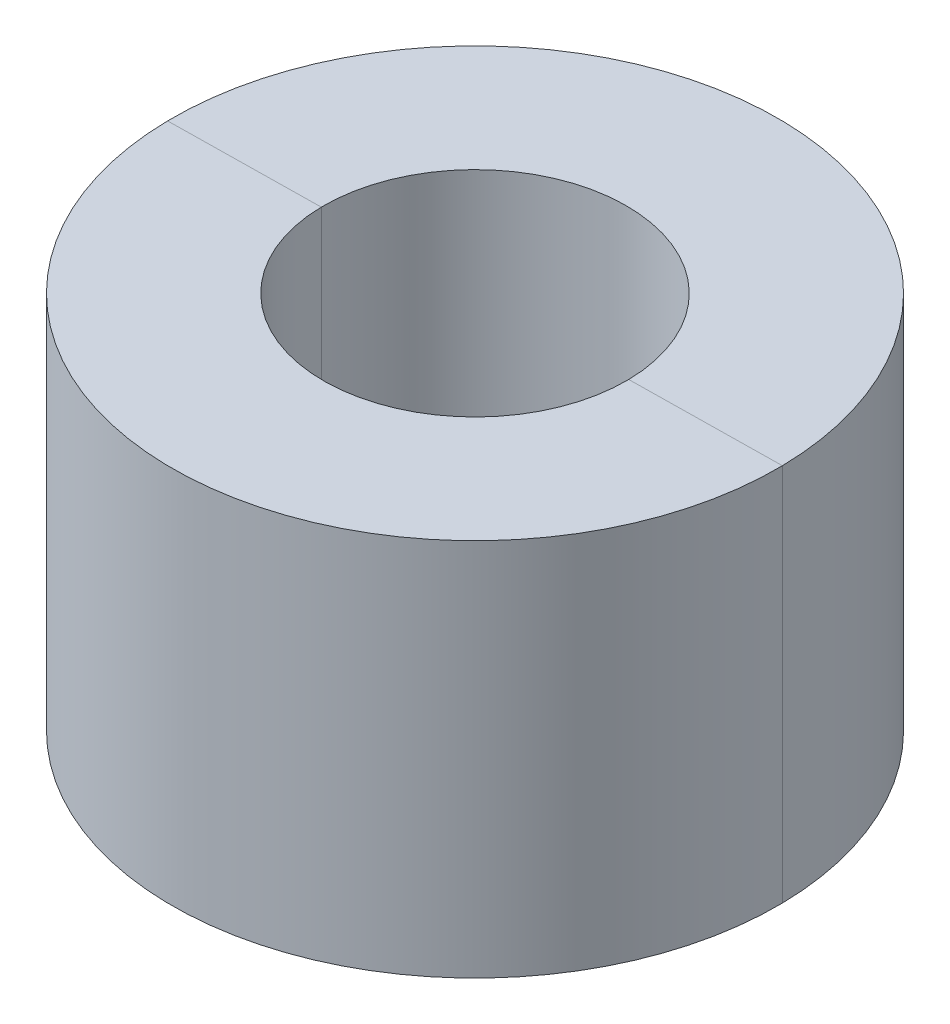
ISO-10303-21;
HEADER;
FILE_DESCRIPTION(('STEP AP214'),'2;1');
FILE_NAME('part.step','',(''),(''),'','','');
FILE_SCHEMA(('AUTOMOTIVE_DESIGN { 1 0 10303 214 1 1 1 1 }'));
ENDSEC;
DATA;
#1=APPLICATION_CONTEXT('core data for automotive mechanical design processes');
#2=APPLICATION_PROTOCOL_DEFINITION('international standard','automotive_design',2000,#1);
#3=PRODUCT_CONTEXT('',#1,'mechanical');
#4=PRODUCT('Part','Part','',(#3));
#5=PRODUCT_RELATED_PRODUCT_CATEGORY('part','',(#4));
#6=PRODUCT_DEFINITION_FORMATION('','',#4);
#7=PRODUCT_DEFINITION_CONTEXT('part definition',#1,'design');
#8=PRODUCT_DEFINITION('design','',#6,#7);
#9=PRODUCT_DEFINITION_SHAPE('','',#8);
#10=(LENGTH_UNIT() NAMED_UNIT(*) SI_UNIT(.MILLI.,.METRE.));
#11=(NAMED_UNIT(*) PLANE_ANGLE_UNIT() SI_UNIT($,.RADIAN.));
#12=(NAMED_UNIT(*) SI_UNIT($,.STERADIAN.) SOLID_ANGLE_UNIT());
#13=UNCERTAINTY_MEASURE_WITH_UNIT(LENGTH_MEASURE(1.E-05),#10,'distance_accuracy_value','');
#14=(GEOMETRIC_REPRESENTATION_CONTEXT(3) GLOBAL_UNCERTAINTY_ASSIGNED_CONTEXT((#13)) GLOBAL_UNIT_ASSIGNED_CONTEXT((#10,
#11,#12)) REPRESENTATION_CONTEXT('',''));
#15=CARTESIAN_POINT('',(0.,0.,0.));
#16=DIRECTION('',(0.,0.,1.));
#17=DIRECTION('',(1.,0.,0.));
#18=AXIS2_PLACEMENT_3D('',#15,#16,#17);
#19=CARTESIAN_POINT('',(-26.5125846974702,-0.00999999999999959,0.38639417159978));
#20=DIRECTION('',(0.0145724435112044,0.,0.999893816307568));
#21=DIRECTION('',(0.999893816307568,0.,-0.0145724435112044));
#22=AXIS2_PLACEMENT_3D('',#19,#20,#21);
#23=PLANE('',#22);
#24=DIRECTION('',(0.999893816307568,0.,-0.0145724435112044));
#25=VECTOR('',#24,1.);
#26=CARTESIAN_POINT('',(0.,25.,0.));
#27=LINE('',#26,#25);
#28=CARTESIAN_POINT('',(-19.9978763261514,25.,0.291448870224088));
#29=VERTEX_POINT('',#28);
#30=CARTESIAN_POINT('',(-9.99893816307568,25.,0.145724435112044));
#31=VERTEX_POINT('',#30);
#32=EDGE_CURVE('E112',#29,#31,#27,.T.);
#33=ORIENTED_EDGE('',*,*,#32,.F.);
#34=DIRECTION('',(0.,-1.,0.));
#35=VECTOR('',#34,1.);
#36=CARTESIAN_POINT('',(-19.9978763261514,25.,0.291448870224087));
#37=LINE('',#36,#35);
#38=CARTESIAN_POINT('',(-19.9978763261514,0.,0.291448870224088));
#39=VERTEX_POINT('',#38);
#40=EDGE_CURVE('E104',#29,#39,#37,.T.);
#41=ORIENTED_EDGE('',*,*,#40,.T.);
#42=DIRECTION('',(0.999893816307568,0.,-0.0145724435112044));
#43=VECTOR('',#42,1.);
#44=CARTESIAN_POINT('',(0.,0.,0.));
#45=LINE('',#44,#43);
#46=CARTESIAN_POINT('',(-9.99893816307568,0.,0.145724435112044));
#47=VERTEX_POINT('',#46);
#48=EDGE_CURVE('E124',#39,#47,#45,.T.);
#49=ORIENTED_EDGE('',*,*,#48,.T.);
#50=DIRECTION('',(0.,-1.,0.));
#51=VECTOR('',#50,1.);
#52=CARTESIAN_POINT('',(-9.99893816307568,25.,0.145724435112044));
#53=LINE('',#52,#51);
#54=EDGE_CURVE('E78',#31,#47,#53,.T.);
#55=ORIENTED_EDGE('',*,*,#54,.F.);
#56=EDGE_LOOP('',(#33,#41,#49,#55));
#57=FACE_BOUND('',#56,.T.);
#58=ADVANCED_FACE('F55',(#57),#23,.T.);
#59=CARTESIAN_POINT('',(9.99893816307568,0.,-0.145724435112044));
#60=VERTEX_POINT('',#59);
#61=CARTESIAN_POINT('',(19.9978763261514,0.,-0.291448870224088));
#62=VERTEX_POINT('',#61);
#63=EDGE_CURVE('E117',#60,#62,#45,.T.);
#64=ORIENTED_EDGE('',*,*,#63,.T.);
#65=DIRECTION('',(0.,-1.,0.));
#66=VECTOR('',#65,1.);
#67=CARTESIAN_POINT('',(19.9978763261514,25.,-0.291448870224087));
#68=LINE('',#67,#66);
#69=CARTESIAN_POINT('',(19.9978763261514,25.,-0.291448870224088));
#70=VERTEX_POINT('',#69);
#71=EDGE_CURVE('E102',#62,#70,#68,.F.);
#72=ORIENTED_EDGE('',*,*,#71,.T.);
#73=CARTESIAN_POINT('',(9.99893816307568,25.,-0.145724435112044));
#74=VERTEX_POINT('',#73);
#75=EDGE_CURVE('E109',#74,#70,#27,.T.);
#76=ORIENTED_EDGE('',*,*,#75,.F.);
#77=DIRECTION('',(0.,-1.,0.));
#78=VECTOR('',#77,1.);
#79=CARTESIAN_POINT('',(9.99893816307568,25.,-0.145724435112044));
#80=LINE('',#79,#78);
#81=EDGE_CURVE('E70',#60,#74,#80,.F.);
#82=ORIENTED_EDGE('',*,*,#81,.F.);
#83=EDGE_LOOP('',(#64,#72,#76,#82));
#84=FACE_BOUND('',#83,.T.);
#85=ADVANCED_FACE('F115',(#84),#23,.T.);
#86=CARTESIAN_POINT('',(0.,0.,0.));
#87=DIRECTION('',(0.,1.,0.));
#88=DIRECTION('',(0.,0.,1.));
#89=AXIS2_PLACEMENT_3D('',#86,#87,#88);
#90=PLANE('',#89);
#91=ORIENTED_EDGE('',*,*,#48,.F.);
#92=CARTESIAN_POINT('',(0.,0.,0.));
#93=DIRECTION('',(0.,1.,0.));
#94=DIRECTION('',(0.,0.,1.));
#95=AXIS2_PLACEMENT_3D('',#92,#93,#94);
#96=CIRCLE('',#95,20.);
#97=EDGE_CURVE('E106',#62,#39,#96,.T.);
#98=ORIENTED_EDGE('',*,*,#97,.F.);
#99=ORIENTED_EDGE('',*,*,#63,.F.);
#100=CARTESIAN_POINT('',(0.,0.,0.));
#101=DIRECTION('',(0.,1.,0.));
#102=DIRECTION('',(1.,0.,0.));
#103=AXIS2_PLACEMENT_3D('',#100,#101,#102);
#104=CIRCLE('',#103,10.);
#105=EDGE_CURVE('E13',#60,#47,#104,.T.);
#106=ORIENTED_EDGE('',*,*,#105,.T.);
#107=EDGE_LOOP('',(#91,#98,#99,#106));
#108=FACE_BOUND('',#107,.T.);
#109=ADVANCED_FACE('F126',(#108),#90,.F.);
#110=CARTESIAN_POINT('',(0.,25.,0.));
#111=DIRECTION('',(0.,1.,0.));
#112=DIRECTION('',(0.,0.,1.));
#113=AXIS2_PLACEMENT_3D('',#110,#111,#112);
#114=PLANE('',#113);
#115=CARTESIAN_POINT('',(0.,25.,0.));
#116=DIRECTION('',(0.,1.,0.));
#117=DIRECTION('',(0.,0.,1.));
#118=AXIS2_PLACEMENT_3D('',#115,#116,#117);
#119=CIRCLE('',#118,20.);
#120=EDGE_CURVE('E98',#70,#29,#119,.T.);
#121=ORIENTED_EDGE('',*,*,#120,.T.);
#122=ORIENTED_EDGE('',*,*,#32,.T.);
#123=CARTESIAN_POINT('',(0.,25.,0.));
#124=DIRECTION('',(0.,1.,0.));
#125=DIRECTION('',(1.,0.,0.));
#126=AXIS2_PLACEMENT_3D('',#123,#124,#125);
#127=CIRCLE('',#126,10.);
#128=EDGE_CURVE('E63',#74,#31,#127,.T.);
#129=ORIENTED_EDGE('',*,*,#128,.F.);
#130=ORIENTED_EDGE('',*,*,#75,.T.);
#131=EDGE_LOOP('',(#121,#122,#129,#130));
#132=FACE_BOUND('',#131,.T.);
#133=ADVANCED_FACE('F110',(#132),#114,.T.);
#134=CARTESIAN_POINT('',(0.,25.,0.));
#135=DIRECTION('',(0.,-1.,0.));
#136=DIRECTION('',(0.,0.,-1.));
#137=AXIS2_PLACEMENT_3D('',#134,#135,#136);
#138=CYLINDRICAL_SURFACE('',#137,10.);
#139=ORIENTED_EDGE('',*,*,#128,.T.);
#140=ORIENTED_EDGE('',*,*,#54,.T.);
#141=ORIENTED_EDGE('',*,*,#105,.F.);
#142=ORIENTED_EDGE('',*,*,#81,.T.);
#143=EDGE_LOOP('',(#139,#140,#141,#142));
#144=FACE_BOUND('',#143,.T.);
#145=ADVANCED_FACE('F57',(#144),#138,.F.);
#146=CARTESIAN_POINT('',(0.,25.,0.));
#147=DIRECTION('',(0.,-1.,0.));
#148=DIRECTION('',(0.,0.,-1.));
#149=AXIS2_PLACEMENT_3D('',#146,#147,#148);
#150=CYLINDRICAL_SURFACE('',#149,20.);
#151=ORIENTED_EDGE('',*,*,#40,.F.);
#152=ORIENTED_EDGE('',*,*,#120,.F.);
#153=ORIENTED_EDGE('',*,*,#71,.F.);
#154=ORIENTED_EDGE('',*,*,#97,.T.);
#155=EDGE_LOOP('',(#151,#152,#153,#154));
#156=FACE_BOUND('',#155,.T.);
#157=ADVANCED_FACE('F100',(#156),#150,.T.);
#158=CLOSED_SHELL('',(#58,#85,#109,#133,#145,#157));
#159=MANIFOLD_SOLID_BREP('B2',#158);
#160=CARTESIAN_POINT('',(-26.5125846974702,-0.00999999999999959,0.38639417159978));
#161=DIRECTION('',(0.0145724435112044,0.,0.999893816307568));
#162=DIRECTION('',(0.999893816307568,0.,-0.0145724435112044));
#163=AXIS2_PLACEMENT_3D('',#160,#161,#162);
#164=PLANE('',#163);
#165=DIRECTION('',(0.999893816307568,0.,-0.0145724435112044));
#166=VECTOR('',#165,1.);
#167=CARTESIAN_POINT('',(0.,25.,0.));
#168=LINE('',#167,#166);
#169=CARTESIAN_POINT('',(-19.9978763261514,25.,0.291448870224088));
#170=VERTEX_POINT('',#169);
#171=CARTESIAN_POINT('',(-9.99893816307568,25.,0.145724435112044));
#172=VERTEX_POINT('',#171);
#173=EDGE_CURVE('E229',#170,#172,#168,.T.);
#174=ORIENTED_EDGE('',*,*,#173,.T.);
#175=DIRECTION('',(0.,-1.,0.));
#176=VECTOR('',#175,1.);
#177=CARTESIAN_POINT('',(-9.99893816307568,25.,0.145724435112044));
#178=LINE('',#177,#176);
#179=CARTESIAN_POINT('',(-9.99893816307568,0.,0.145724435112044));
#180=VERTEX_POINT('',#179);
#181=EDGE_CURVE('E184',#172,#180,#178,.T.);
#182=ORIENTED_EDGE('',*,*,#181,.T.);
#183=DIRECTION('',(0.999893816307568,0.,-0.0145724435112044));
#184=VECTOR('',#183,1.);
#185=CARTESIAN_POINT('',(0.,0.,0.));
#186=LINE('',#185,#184);
#187=CARTESIAN_POINT('',(-19.9978763261514,0.,0.291448870224088));
#188=VERTEX_POINT('',#187);
#189=EDGE_CURVE('E241',#188,#180,#186,.T.);
#190=ORIENTED_EDGE('',*,*,#189,.F.);
#191=DIRECTION('',(0.,-1.,0.));
#192=VECTOR('',#191,1.);
#193=CARTESIAN_POINT('',(-19.9978763261514,25.,0.291448870224087));
#194=LINE('',#193,#192);
#195=EDGE_CURVE('E179',#170,#188,#194,.T.);
#196=ORIENTED_EDGE('',*,*,#195,.F.);
#197=EDGE_LOOP('',(#174,#182,#190,#196));
#198=FACE_BOUND('',#197,.T.);
#199=ADVANCED_FACE('F176',(#198),#164,.F.);
#200=CARTESIAN_POINT('',(9.99893816307568,0.,-0.145724435112044));
#201=VERTEX_POINT('',#200);
#202=CARTESIAN_POINT('',(19.9978763261514,0.,-0.291448870224088));
#203=VERTEX_POINT('',#202);
#204=EDGE_CURVE('E242',#201,#203,#186,.T.);
#205=ORIENTED_EDGE('',*,*,#204,.F.);
#206=DIRECTION('',(0.,-1.,0.));
#207=VECTOR('',#206,1.);
#208=CARTESIAN_POINT('',(9.99893816307568,25.,-0.145724435112044));
#209=LINE('',#208,#207);
#210=CARTESIAN_POINT('',(9.99893816307568,25.,-0.145724435112044));
#211=VERTEX_POINT('',#210);
#212=EDGE_CURVE('E53',#201,#211,#209,.F.);
#213=ORIENTED_EDGE('',*,*,#212,.T.);
#214=CARTESIAN_POINT('',(19.9978763261514,25.,-0.291448870224088));
#215=VERTEX_POINT('',#214);
#216=EDGE_CURVE('E192',#211,#215,#168,.T.);
#217=ORIENTED_EDGE('',*,*,#216,.T.);
#218=DIRECTION('',(0.,-1.,0.));
#219=VECTOR('',#218,1.);
#220=CARTESIAN_POINT('',(19.9978763261514,25.,-0.291448870224087));
#221=LINE('',#220,#219);
#222=EDGE_CURVE('E220',#203,#215,#221,.F.);
#223=ORIENTED_EDGE('',*,*,#222,.F.);
#224=EDGE_LOOP('',(#205,#213,#217,#223));
#225=FACE_BOUND('',#224,.T.);
#226=ADVANCED_FACE('F228',(#225),#164,.F.);
#227=CARTESIAN_POINT('',(0.,25.,0.));
#228=DIRECTION('',(0.,1.,0.));
#229=DIRECTION('',(0.,0.,1.));
#230=AXIS2_PLACEMENT_3D('',#227,#228,#229);
#231=PLANE('',#230);
#232=ORIENTED_EDGE('',*,*,#173,.F.);
#233=CARTESIAN_POINT('',(0.,25.,0.));
#234=DIRECTION('',(0.,1.,0.));
#235=DIRECTION('',(0.,0.,1.));
#236=AXIS2_PLACEMENT_3D('',#233,#234,#235);
#237=CIRCLE('',#236,20.);
#238=EDGE_CURVE('E222',#170,#215,#237,.T.);
#239=ORIENTED_EDGE('',*,*,#238,.T.);
#240=ORIENTED_EDGE('',*,*,#216,.F.);
#241=CARTESIAN_POINT('',(0.,25.,0.));
#242=DIRECTION('',(0.,1.,0.));
#243=DIRECTION('',(1.,0.,0.));
#244=AXIS2_PLACEMENT_3D('',#241,#242,#243);
#245=CIRCLE('',#244,10.);
#246=EDGE_CURVE('E234',#172,#211,#245,.T.);
#247=ORIENTED_EDGE('',*,*,#246,.F.);
#248=EDGE_LOOP('',(#232,#239,#240,#247));
#249=FACE_BOUND('',#248,.T.);
#250=ADVANCED_FACE('F232',(#249),#231,.T.);
#251=CARTESIAN_POINT('',(0.,0.,0.));
#252=DIRECTION('',(0.,1.,0.));
#253=DIRECTION('',(0.,0.,1.));
#254=AXIS2_PLACEMENT_3D('',#251,#252,#253);
#255=PLANE('',#254);
#256=CARTESIAN_POINT('',(0.,0.,0.));
#257=DIRECTION('',(0.,1.,0.));
#258=DIRECTION('',(0.,0.,1.));
#259=AXIS2_PLACEMENT_3D('',#256,#257,#258);
#260=CIRCLE('',#259,20.);
#261=EDGE_CURVE('E224',#188,#203,#260,.T.);
#262=ORIENTED_EDGE('',*,*,#261,.F.);
#263=ORIENTED_EDGE('',*,*,#189,.T.);
#264=CARTESIAN_POINT('',(0.,0.,0.));
#265=DIRECTION('',(0.,1.,0.));
#266=DIRECTION('',(1.,0.,0.));
#267=AXIS2_PLACEMENT_3D('',#264,#265,#266);
#268=CIRCLE('',#267,10.);
#269=EDGE_CURVE('E237',#180,#201,#268,.T.);
#270=ORIENTED_EDGE('',*,*,#269,.T.);
#271=ORIENTED_EDGE('',*,*,#204,.T.);
#272=EDGE_LOOP('',(#262,#263,#270,#271));
#273=FACE_BOUND('',#272,.T.);
#274=ADVANCED_FACE('F247',(#273),#255,.F.);
#275=CARTESIAN_POINT('',(0.,25.,0.));
#276=DIRECTION('',(0.,-1.,0.));
#277=DIRECTION('',(0.,0.,-1.));
#278=AXIS2_PLACEMENT_3D('',#275,#276,#277);
#279=CYLINDRICAL_SURFACE('',#278,20.);
#280=ORIENTED_EDGE('',*,*,#238,.F.);
#281=ORIENTED_EDGE('',*,*,#195,.T.);
#282=ORIENTED_EDGE('',*,*,#261,.T.);
#283=ORIENTED_EDGE('',*,*,#222,.T.);
#284=EDGE_LOOP('',(#280,#281,#282,#283));
#285=FACE_BOUND('',#284,.T.);
#286=ADVANCED_FACE('F221',(#285),#279,.T.);
#287=CARTESIAN_POINT('',(0.,25.,0.));
#288=DIRECTION('',(0.,-1.,0.));
#289=DIRECTION('',(0.,0.,-1.));
#290=AXIS2_PLACEMENT_3D('',#287,#288,#289);
#291=CYLINDRICAL_SURFACE('',#290,10.);
#292=ORIENTED_EDGE('',*,*,#181,.F.);
#293=ORIENTED_EDGE('',*,*,#246,.T.);
#294=ORIENTED_EDGE('',*,*,#212,.F.);
#295=ORIENTED_EDGE('',*,*,#269,.F.);
#296=EDGE_LOOP('',(#292,#293,#294,#295));
#297=FACE_BOUND('',#296,.T.);
#298=ADVANCED_FACE('F254',(#297),#291,.F.);
#299=CLOSED_SHELL('',(#199,#226,#250,#274,#286,#298));
#300=MANIFOLD_SOLID_BREP('B7',#299);
#301=ADVANCED_BREP_SHAPE_REPRESENTATION('',(#18,#159,#300),#14);
#302=SHAPE_DEFINITION_REPRESENTATION(#9,#301);
ENDSEC;
END-ISO-10303-21;
